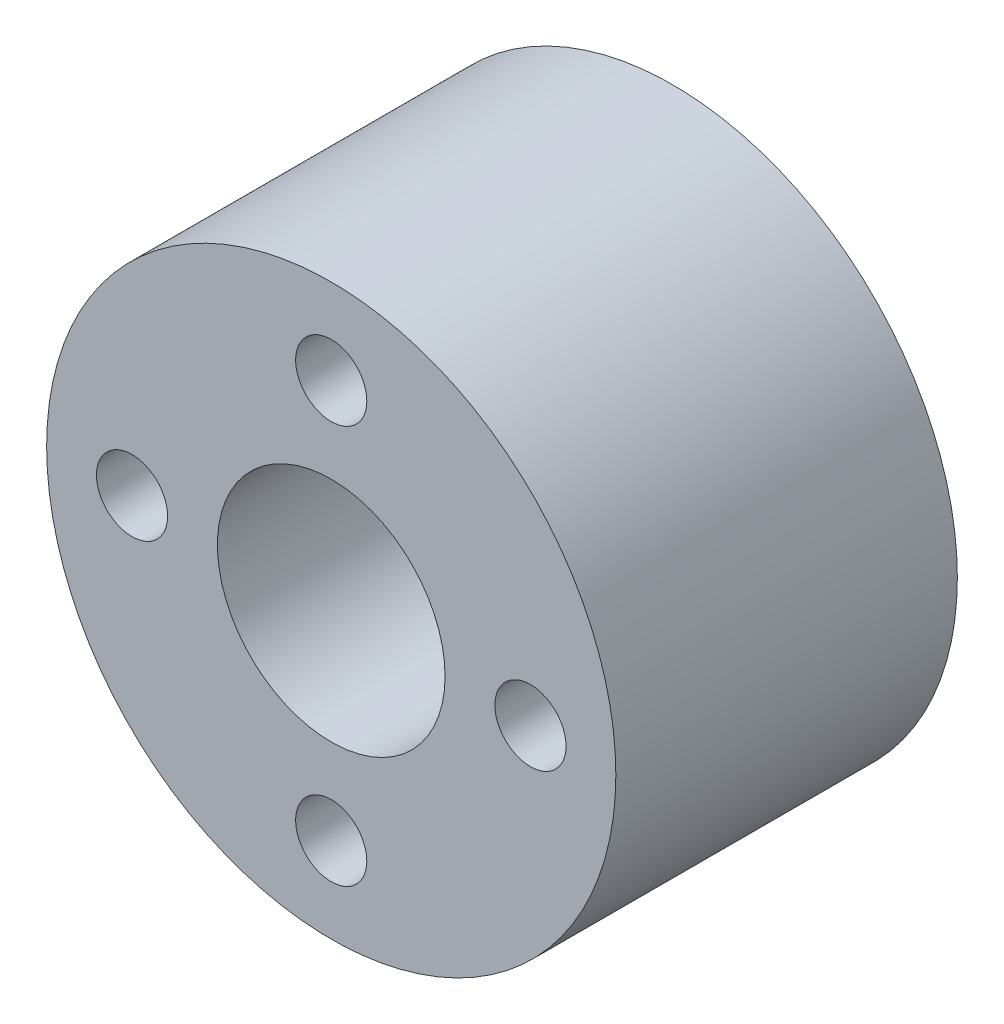
ISO-10303-21;
HEADER;
FILE_DESCRIPTION(('STEP AP214'),'2;1');
FILE_NAME('part.step','',(''),(''),'','','');
FILE_SCHEMA(('AUTOMOTIVE_DESIGN { 1 0 10303 214 1 1 1 1 }'));
ENDSEC;
DATA;
#1=APPLICATION_CONTEXT('core data for automotive mechanical design processes');
#2=APPLICATION_PROTOCOL_DEFINITION('international standard','automotive_design',2000,#1);
#3=PRODUCT_CONTEXT('',#1,'mechanical');
#4=PRODUCT('Part','Part','',(#3));
#5=PRODUCT_RELATED_PRODUCT_CATEGORY('part','',(#4));
#6=PRODUCT_DEFINITION_FORMATION('','',#4);
#7=PRODUCT_DEFINITION_CONTEXT('part definition',#1,'design');
#8=PRODUCT_DEFINITION('design','',#6,#7);
#9=PRODUCT_DEFINITION_SHAPE('','',#8);
#10=(LENGTH_UNIT() NAMED_UNIT(*) SI_UNIT(.MILLI.,.METRE.));
#11=(NAMED_UNIT(*) PLANE_ANGLE_UNIT() SI_UNIT($,.RADIAN.));
#12=(NAMED_UNIT(*) SI_UNIT($,.STERADIAN.) SOLID_ANGLE_UNIT());
#13=UNCERTAINTY_MEASURE_WITH_UNIT(LENGTH_MEASURE(1.E-05),#10,'distance_accuracy_value','');
#14=(GEOMETRIC_REPRESENTATION_CONTEXT(3) GLOBAL_UNCERTAINTY_ASSIGNED_CONTEXT((#13)) GLOBAL_UNIT_ASSIGNED_CONTEXT((#10,
#11,#12)) REPRESENTATION_CONTEXT('',''));
#15=CARTESIAN_POINT('',(0.,0.,0.));
#16=DIRECTION('',(0.,0.,1.));
#17=DIRECTION('',(1.,0.,0.));
#18=AXIS2_PLACEMENT_3D('',#15,#16,#17);
#19=CARTESIAN_POINT('',(0.,0.,12.));
#20=DIRECTION('',(0.,0.,1.));
#21=DIRECTION('',(1.,0.,0.));
#22=AXIS2_PLACEMENT_3D('',#19,#20,#21);
#23=PLANE('',#22);
#24=CARTESIAN_POINT('',(-7.,0.,12.));
#25=DIRECTION('',(0.,0.,1.));
#26=DIRECTION('',(1.,0.,0.));
#27=AXIS2_PLACEMENT_3D('',#24,#25,#26);
#28=CIRCLE('',#27,1.25);
#29=CARTESIAN_POINT('',(-5.75,0.,12.));
#30=VERTEX_POINT('',#29);
#31=EDGE_CURVE('E59',#30,#30,#28,.T.);
#32=ORIENTED_EDGE('',*,*,#31,.F.);
#33=EDGE_LOOP('',(#32));
#34=FACE_BOUND('',#33,.T.);
#35=CARTESIAN_POINT('',(7.,0.,12.));
#36=DIRECTION('',(0.,0.,1.));
#37=DIRECTION('',(1.,0.,0.));
#38=AXIS2_PLACEMENT_3D('',#35,#36,#37);
#39=CIRCLE('',#38,1.25);
#40=CARTESIAN_POINT('',(8.25,0.,12.));
#41=VERTEX_POINT('',#40);
#42=EDGE_CURVE('E47',#41,#41,#39,.T.);
#43=ORIENTED_EDGE('',*,*,#42,.F.);
#44=EDGE_LOOP('',(#43));
#45=FACE_BOUND('',#44,.T.);
#46=CARTESIAN_POINT('',(0.,0.,12.));
#47=DIRECTION('',(0.,0.,1.));
#48=DIRECTION('',(1.,0.,0.));
#49=AXIS2_PLACEMENT_3D('',#46,#47,#48);
#50=CIRCLE('',#49,10.);
#51=CARTESIAN_POINT('',(10.,0.,12.));
#52=VERTEX_POINT('',#51);
#53=EDGE_CURVE('E10',#52,#52,#50,.T.);
#54=ORIENTED_EDGE('',*,*,#53,.T.);
#55=EDGE_LOOP('',(#54));
#56=FACE_BOUND('',#55,.T.);
#57=CARTESIAN_POINT('',(0.,0.,12.));
#58=DIRECTION('',(0.,0.,1.));
#59=DIRECTION('',(1.,0.,0.));
#60=AXIS2_PLACEMENT_3D('',#57,#58,#59);
#61=CIRCLE('',#60,4.);
#62=CARTESIAN_POINT('',(4.,0.,12.));
#63=VERTEX_POINT('',#62);
#64=EDGE_CURVE('E42',#63,#63,#61,.T.);
#65=ORIENTED_EDGE('',*,*,#64,.F.);
#66=EDGE_LOOP('',(#65));
#67=FACE_BOUND('',#66,.T.);
#68=CARTESIAN_POINT('',(0.,-7.,12.));
#69=DIRECTION('',(0.,0.,1.));
#70=DIRECTION('',(1.,0.,0.));
#71=AXIS2_PLACEMENT_3D('',#68,#69,#70);
#72=CIRCLE('',#71,1.25);
#73=CARTESIAN_POINT('',(1.24999999999998,-7.,12.));
#74=VERTEX_POINT('',#73);
#75=EDGE_CURVE('E53',#74,#74,#72,.T.);
#76=ORIENTED_EDGE('',*,*,#75,.F.);
#77=EDGE_LOOP('',(#76));
#78=FACE_BOUND('',#77,.T.);
#79=CARTESIAN_POINT('',(0.,7.,12.));
#80=DIRECTION('',(0.,0.,1.));
#81=DIRECTION('',(1.,0.,0.));
#82=AXIS2_PLACEMENT_3D('',#79,#80,#81);
#83=CIRCLE('',#82,1.25);
#84=CARTESIAN_POINT('',(1.25000000000007,7.,12.));
#85=VERTEX_POINT('',#84);
#86=EDGE_CURVE('E65',#85,#85,#83,.T.);
#87=ORIENTED_EDGE('',*,*,#86,.F.);
#88=EDGE_LOOP('',(#87));
#89=FACE_BOUND('',#88,.T.);
#90=ADVANCED_FACE('F31',(#34,#45,#56,#67,#78,#89),#23,.T.);
#91=CARTESIAN_POINT('',(0.,0.,0.));
#92=DIRECTION('',(0.,0.,1.));
#93=DIRECTION('',(1.,0.,0.));
#94=AXIS2_PLACEMENT_3D('',#91,#92,#93);
#95=PLANE('',#94);
#96=CARTESIAN_POINT('',(0.,0.,0.));
#97=DIRECTION('',(0.,0.,1.));
#98=DIRECTION('',(1.,0.,0.));
#99=AXIS2_PLACEMENT_3D('',#96,#97,#98);
#100=CIRCLE('',#99,10.);
#101=CARTESIAN_POINT('',(10.,0.,0.));
#102=VERTEX_POINT('',#101);
#103=EDGE_CURVE('E35',#102,#102,#100,.T.);
#104=ORIENTED_EDGE('',*,*,#103,.F.);
#105=EDGE_LOOP('',(#104));
#106=FACE_BOUND('',#105,.T.);
#107=CARTESIAN_POINT('',(0.,0.,0.));
#108=DIRECTION('',(0.,0.,1.));
#109=DIRECTION('',(1.,0.,0.));
#110=AXIS2_PLACEMENT_3D('',#107,#108,#109);
#111=CIRCLE('',#110,4.);
#112=CARTESIAN_POINT('',(4.,0.,0.));
#113=VERTEX_POINT('',#112);
#114=EDGE_CURVE('E44',#113,#113,#111,.T.);
#115=ORIENTED_EDGE('',*,*,#114,.T.);
#116=EDGE_LOOP('',(#115));
#117=FACE_BOUND('',#116,.T.);
#118=CARTESIAN_POINT('',(7.,0.,0.));
#119=DIRECTION('',(0.,0.,1.));
#120=DIRECTION('',(1.,0.,0.));
#121=AXIS2_PLACEMENT_3D('',#118,#119,#120);
#122=CIRCLE('',#121,1.25);
#123=CARTESIAN_POINT('',(8.25,0.,0.));
#124=VERTEX_POINT('',#123);
#125=EDGE_CURVE('E50',#124,#124,#122,.T.);
#126=ORIENTED_EDGE('',*,*,#125,.T.);
#127=EDGE_LOOP('',(#126));
#128=FACE_BOUND('',#127,.T.);
#129=CARTESIAN_POINT('',(0.,-7.,0.));
#130=DIRECTION('',(0.,0.,1.));
#131=DIRECTION('',(1.,0.,0.));
#132=AXIS2_PLACEMENT_3D('',#129,#130,#131);
#133=CIRCLE('',#132,1.25);
#134=CARTESIAN_POINT('',(1.24999999999998,-7.,0.));
#135=VERTEX_POINT('',#134);
#136=EDGE_CURVE('E56',#135,#135,#133,.T.);
#137=ORIENTED_EDGE('',*,*,#136,.T.);
#138=EDGE_LOOP('',(#137));
#139=FACE_BOUND('',#138,.T.);
#140=CARTESIAN_POINT('',(-7.,0.,0.));
#141=DIRECTION('',(0.,0.,1.));
#142=DIRECTION('',(1.,0.,0.));
#143=AXIS2_PLACEMENT_3D('',#140,#141,#142);
#144=CIRCLE('',#143,1.25);
#145=CARTESIAN_POINT('',(-5.75,0.,0.));
#146=VERTEX_POINT('',#145);
#147=EDGE_CURVE('E62',#146,#146,#144,.T.);
#148=ORIENTED_EDGE('',*,*,#147,.T.);
#149=EDGE_LOOP('',(#148));
#150=FACE_BOUND('',#149,.T.);
#151=CARTESIAN_POINT('',(0.,7.,0.));
#152=DIRECTION('',(0.,0.,1.));
#153=DIRECTION('',(1.,0.,0.));
#154=AXIS2_PLACEMENT_3D('',#151,#152,#153);
#155=CIRCLE('',#154,1.25);
#156=CARTESIAN_POINT('',(1.25000000000007,7.,0.));
#157=VERTEX_POINT('',#156);
#158=EDGE_CURVE('E68',#157,#157,#155,.T.);
#159=ORIENTED_EDGE('',*,*,#158,.T.);
#160=EDGE_LOOP('',(#159));
#161=FACE_BOUND('',#160,.T.);
#162=ADVANCED_FACE('F78',(#106,#117,#128,#139,#150,#161),#95,.F.);
#163=CARTESIAN_POINT('',(0.,0.,12.));
#164=DIRECTION('',(0.,0.,-1.));
#165=DIRECTION('',(-1.,0.,0.));
#166=AXIS2_PLACEMENT_3D('',#163,#164,#165);
#167=CYLINDRICAL_SURFACE('',#166,10.);
#168=ORIENTED_EDGE('',*,*,#53,.F.);
#169=EDGE_LOOP('',(#168));
#170=FACE_BOUND('',#169,.T.);
#171=ORIENTED_EDGE('',*,*,#103,.T.);
#172=EDGE_LOOP('',(#171));
#173=FACE_BOUND('',#172,.T.);
#174=ADVANCED_FACE('F33',(#170,#173),#167,.T.);
#175=CARTESIAN_POINT('',(0.,0.,12.));
#176=DIRECTION('',(0.,0.,-1.));
#177=DIRECTION('',(-1.,0.,0.));
#178=AXIS2_PLACEMENT_3D('',#175,#176,#177);
#179=CYLINDRICAL_SURFACE('',#178,4.);
#180=ORIENTED_EDGE('',*,*,#64,.T.);
#181=EDGE_LOOP('',(#180));
#182=FACE_BOUND('',#181,.T.);
#183=ORIENTED_EDGE('',*,*,#114,.F.);
#184=EDGE_LOOP('',(#183));
#185=FACE_BOUND('',#184,.T.);
#186=ADVANCED_FACE('F88',(#182,#185),#179,.F.);
#187=CARTESIAN_POINT('',(7.,0.,12.));
#188=DIRECTION('',(0.,0.,-1.));
#189=DIRECTION('',(-1.,0.,0.));
#190=AXIS2_PLACEMENT_3D('',#187,#188,#189);
#191=CYLINDRICAL_SURFACE('',#190,1.25);
#192=ORIENTED_EDGE('',*,*,#42,.T.);
#193=EDGE_LOOP('',(#192));
#194=FACE_BOUND('',#193,.T.);
#195=ORIENTED_EDGE('',*,*,#125,.F.);
#196=EDGE_LOOP('',(#195));
#197=FACE_BOUND('',#196,.T.);
#198=ADVANCED_FACE('F91',(#194,#197),#191,.F.);
#199=CARTESIAN_POINT('',(0.,-7.,12.));
#200=DIRECTION('',(0.,0.,-1.));
#201=DIRECTION('',(-1.,0.,0.));
#202=AXIS2_PLACEMENT_3D('',#199,#200,#201);
#203=CYLINDRICAL_SURFACE('',#202,1.25);
#204=ORIENTED_EDGE('',*,*,#75,.T.);
#205=EDGE_LOOP('',(#204));
#206=FACE_BOUND('',#205,.T.);
#207=ORIENTED_EDGE('',*,*,#136,.F.);
#208=EDGE_LOOP('',(#207));
#209=FACE_BOUND('',#208,.T.);
#210=ADVANCED_FACE('F95',(#206,#209),#203,.F.);
#211=CARTESIAN_POINT('',(-7.,0.,12.));
#212=DIRECTION('',(0.,0.,-1.));
#213=DIRECTION('',(-1.,0.,0.));
#214=AXIS2_PLACEMENT_3D('',#211,#212,#213);
#215=CYLINDRICAL_SURFACE('',#214,1.25);
#216=ORIENTED_EDGE('',*,*,#31,.T.);
#217=EDGE_LOOP('',(#216));
#218=FACE_BOUND('',#217,.T.);
#219=ORIENTED_EDGE('',*,*,#147,.F.);
#220=EDGE_LOOP('',(#219));
#221=FACE_BOUND('',#220,.T.);
#222=ADVANCED_FACE('F99',(#218,#221),#215,.F.);
#223=CARTESIAN_POINT('',(0.,7.,12.));
#224=DIRECTION('',(0.,0.,-1.));
#225=DIRECTION('',(-1.,0.,0.));
#226=AXIS2_PLACEMENT_3D('',#223,#224,#225);
#227=CYLINDRICAL_SURFACE('',#226,1.25);
#228=ORIENTED_EDGE('',*,*,#86,.T.);
#229=EDGE_LOOP('',(#228));
#230=FACE_BOUND('',#229,.T.);
#231=ORIENTED_EDGE('',*,*,#158,.F.);
#232=EDGE_LOOP('',(#231));
#233=FACE_BOUND('',#232,.T.);
#234=ADVANCED_FACE('F74',(#230,#233),#227,.F.);
#235=CLOSED_SHELL('',(#90,#162,#174,#186,#198,#210,#222,#234));
#236=MANIFOLD_SOLID_BREP('B2',#235);
#237=ADVANCED_BREP_SHAPE_REPRESENTATION('',(#18,#236),#14);
#238=SHAPE_DEFINITION_REPRESENTATION(#9,#237);
ENDSEC;
END-ISO-10303-21;
